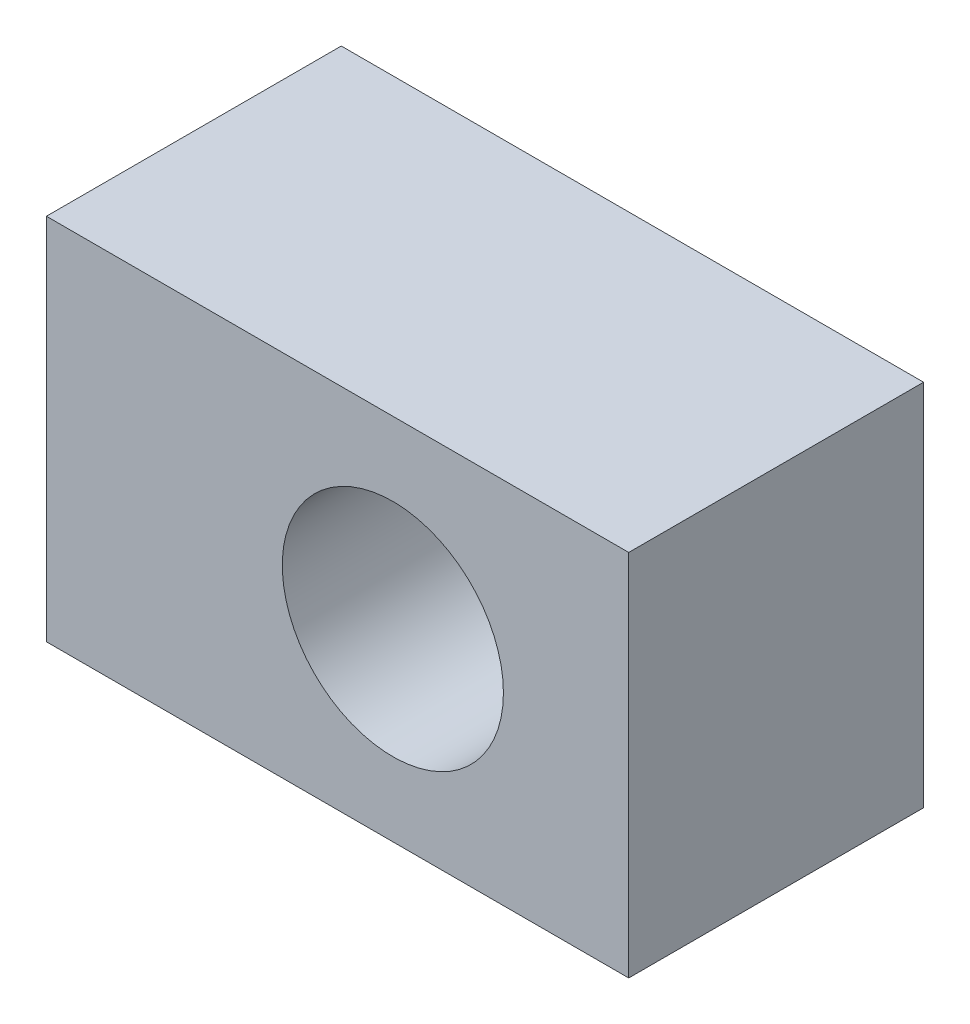
ISO-10303-21;
HEADER;
FILE_DESCRIPTION(('STEP AP214'),'2;1');
FILE_NAME('part.step','',(''),(''),'','','');
FILE_SCHEMA(('AUTOMOTIVE_DESIGN { 1 0 10303 214 1 1 1 1 }'));
ENDSEC;
DATA;
#1=APPLICATION_CONTEXT('core data for automotive mechanical design processes');
#2=APPLICATION_PROTOCOL_DEFINITION('international standard','automotive_design',2000,#1);
#3=PRODUCT_CONTEXT('',#1,'mechanical');
#4=PRODUCT('Part','Part','',(#3));
#5=PRODUCT_RELATED_PRODUCT_CATEGORY('part','',(#4));
#6=PRODUCT_DEFINITION_FORMATION('','',#4);
#7=PRODUCT_DEFINITION_CONTEXT('part definition',#1,'design');
#8=PRODUCT_DEFINITION('design','',#6,#7);
#9=PRODUCT_DEFINITION_SHAPE('','',#8);
#10=(LENGTH_UNIT() NAMED_UNIT(*) SI_UNIT(.MILLI.,.METRE.));
#11=(NAMED_UNIT(*) PLANE_ANGLE_UNIT() SI_UNIT($,.RADIAN.));
#12=(NAMED_UNIT(*) SI_UNIT($,.STERADIAN.) SOLID_ANGLE_UNIT());
#13=UNCERTAINTY_MEASURE_WITH_UNIT(LENGTH_MEASURE(1.E-05),#10,'distance_accuracy_value','');
#14=(GEOMETRIC_REPRESENTATION_CONTEXT(3) GLOBAL_UNCERTAINTY_ASSIGNED_CONTEXT((#13)) GLOBAL_UNIT_ASSIGNED_CONTEXT((#10,
#11,#12)) REPRESENTATION_CONTEXT('',''));
#15=CARTESIAN_POINT('',(0.,0.,0.));
#16=DIRECTION('',(0.,0.,1.));
#17=DIRECTION('',(1.,0.,0.));
#18=AXIS2_PLACEMENT_3D('',#15,#16,#17);
#19=CARTESIAN_POINT('',(0.,0.,40.));
#20=DIRECTION('',(0.,0.,-1.));
#21=DIRECTION('',(-1.,0.,0.));
#22=AXIS2_PLACEMENT_3D('',#19,#20,#21);
#23=PLANE('',#22);
#24=DIRECTION('',(0.,-1.,0.));
#25=VECTOR('',#24,1.);
#26=CARTESIAN_POINT('',(0.,0.,40.));
#27=LINE('',#26,#25);
#28=CARTESIAN_POINT('',(0.,50.,40.));
#29=VERTEX_POINT('',#28);
#30=CARTESIAN_POINT('',(0.,0.,40.));
#31=VERTEX_POINT('',#30);
#32=EDGE_CURVE('E87',#29,#31,#27,.T.);
#33=ORIENTED_EDGE('',*,*,#32,.T.);
#34=DIRECTION('',(1.,0.,0.));
#35=VECTOR('',#34,1.);
#36=CARTESIAN_POINT('',(0.,0.,40.));
#37=LINE('',#36,#35);
#38=CARTESIAN_POINT('',(79.,0.,40.));
#39=VERTEX_POINT('',#38);
#40=EDGE_CURVE('E82',#31,#39,#37,.T.);
#41=ORIENTED_EDGE('',*,*,#40,.T.);
#42=DIRECTION('',(0.,1.,0.));
#43=VECTOR('',#42,1.);
#44=CARTESIAN_POINT('',(79.,0.,40.));
#45=LINE('',#44,#43);
#46=CARTESIAN_POINT('',(79.,50.,40.));
#47=VERTEX_POINT('',#46);
#48=EDGE_CURVE('E85',#39,#47,#45,.T.);
#49=ORIENTED_EDGE('',*,*,#48,.T.);
#50=DIRECTION('',(-1.,0.,0.));
#51=VECTOR('',#50,1.);
#52=CARTESIAN_POINT('',(0.,50.,40.));
#53=LINE('',#52,#51);
#54=EDGE_CURVE('E52',#47,#29,#53,.T.);
#55=ORIENTED_EDGE('',*,*,#54,.T.);
#56=EDGE_LOOP('',(#33,#41,#49,#55));
#57=FACE_BOUND('',#56,.T.);
#58=CARTESIAN_POINT('',(47.,25.,40.));
#59=DIRECTION('',(0.,0.,1.));
#60=DIRECTION('',(1.,0.,0.));
#61=AXIS2_PLACEMENT_3D('',#58,#59,#60);
#62=CIRCLE('',#61,15.);
#63=CARTESIAN_POINT('',(62.,25.,40.));
#64=VERTEX_POINT('',#63);
#65=EDGE_CURVE('E102',#64,#64,#62,.T.);
#66=ORIENTED_EDGE('',*,*,#65,.F.);
#67=EDGE_LOOP('',(#66));
#68=FACE_BOUND('',#67,.T.);
#69=ADVANCED_FACE('F35',(#57,#68),#23,.F.);
#70=CARTESIAN_POINT('',(0.,0.,0.));
#71=DIRECTION('',(0.,0.,-1.));
#72=DIRECTION('',(-1.,0.,0.));
#73=AXIS2_PLACEMENT_3D('',#70,#71,#72);
#74=PLANE('',#73);
#75=DIRECTION('',(0.,-1.,0.));
#76=VECTOR('',#75,1.);
#77=CARTESIAN_POINT('',(0.,0.,0.));
#78=LINE('',#77,#76);
#79=CARTESIAN_POINT('',(0.,50.,0.));
#80=VERTEX_POINT('',#79);
#81=CARTESIAN_POINT('',(0.,0.,0.));
#82=VERTEX_POINT('',#81);
#83=EDGE_CURVE('E99',#80,#82,#78,.T.);
#84=ORIENTED_EDGE('',*,*,#83,.F.);
#85=DIRECTION('',(-1.,0.,0.));
#86=VECTOR('',#85,1.);
#87=CARTESIAN_POINT('',(0.,50.,0.));
#88=LINE('',#87,#86);
#89=CARTESIAN_POINT('',(79.,50.,0.));
#90=VERTEX_POINT('',#89);
#91=EDGE_CURVE('E75',#90,#80,#88,.T.);
#92=ORIENTED_EDGE('',*,*,#91,.F.);
#93=DIRECTION('',(0.,1.,0.));
#94=VECTOR('',#93,1.);
#95=CARTESIAN_POINT('',(79.,0.,0.));
#96=LINE('',#95,#94);
#97=CARTESIAN_POINT('',(79.,0.,0.));
#98=VERTEX_POINT('',#97);
#99=EDGE_CURVE('E69',#98,#90,#96,.T.);
#100=ORIENTED_EDGE('',*,*,#99,.F.);
#101=DIRECTION('',(1.,0.,0.));
#102=VECTOR('',#101,1.);
#103=CARTESIAN_POINT('',(0.,0.,0.));
#104=LINE('',#103,#102);
#105=EDGE_CURVE('E91',#82,#98,#104,.T.);
#106=ORIENTED_EDGE('',*,*,#105,.F.);
#107=EDGE_LOOP('',(#84,#92,#100,#106));
#108=FACE_BOUND('',#107,.T.);
#109=CARTESIAN_POINT('',(47.,25.,0.));
#110=DIRECTION('',(0.,0.,1.));
#111=DIRECTION('',(1.,0.,0.));
#112=AXIS2_PLACEMENT_3D('',#109,#110,#111);
#113=CIRCLE('',#112,15.);
#114=CARTESIAN_POINT('',(62.,25.,0.));
#115=VERTEX_POINT('',#114);
#116=EDGE_CURVE('E114',#115,#115,#113,.T.);
#117=ORIENTED_EDGE('',*,*,#116,.T.);
#118=EDGE_LOOP('',(#117));
#119=FACE_BOUND('',#118,.T.);
#120=ADVANCED_FACE('F110',(#108,#119),#74,.T.);
#121=CARTESIAN_POINT('',(0.,0.,40.));
#122=DIRECTION('',(1.,0.,0.));
#123=DIRECTION('',(0.,1.,0.));
#124=AXIS2_PLACEMENT_3D('',#121,#122,#123);
#125=PLANE('',#124);
#126=ORIENTED_EDGE('',*,*,#83,.T.);
#127=DIRECTION('',(0.,0.,-1.));
#128=VECTOR('',#127,1.);
#129=CARTESIAN_POINT('',(0.,0.,40.));
#130=LINE('',#129,#128);
#131=EDGE_CURVE('E11',#31,#82,#130,.T.);
#132=ORIENTED_EDGE('',*,*,#131,.F.);
#133=ORIENTED_EDGE('',*,*,#32,.F.);
#134=DIRECTION('',(0.,0.,-1.));
#135=VECTOR('',#134,1.);
#136=CARTESIAN_POINT('',(0.,50.,40.));
#137=LINE('',#136,#135);
#138=EDGE_CURVE('E95',#29,#80,#137,.T.);
#139=ORIENTED_EDGE('',*,*,#138,.T.);
#140=EDGE_LOOP('',(#126,#132,#133,#139));
#141=FACE_BOUND('',#140,.T.);
#142=ADVANCED_FACE('F37',(#141),#125,.F.);
#143=CARTESIAN_POINT('',(0.,0.,40.));
#144=DIRECTION('',(0.,1.,0.));
#145=DIRECTION('',(0.,0.,1.));
#146=AXIS2_PLACEMENT_3D('',#143,#144,#145);
#147=PLANE('',#146);
#148=ORIENTED_EDGE('',*,*,#105,.T.);
#149=DIRECTION('',(0.,0.,-1.));
#150=VECTOR('',#149,1.);
#151=CARTESIAN_POINT('',(79.,0.,40.));
#152=LINE('',#151,#150);
#153=EDGE_CURVE('E44',#39,#98,#152,.T.);
#154=ORIENTED_EDGE('',*,*,#153,.F.);
#155=ORIENTED_EDGE('',*,*,#40,.F.);
#156=ORIENTED_EDGE('',*,*,#131,.T.);
#157=EDGE_LOOP('',(#148,#154,#155,#156));
#158=FACE_BOUND('',#157,.T.);
#159=ADVANCED_FACE('F90',(#158),#147,.F.);
#160=CARTESIAN_POINT('',(79.,0.,40.));
#161=DIRECTION('',(-1.,0.,0.));
#162=DIRECTION('',(0.,-1.,0.));
#163=AXIS2_PLACEMENT_3D('',#160,#161,#162);
#164=PLANE('',#163);
#165=ORIENTED_EDGE('',*,*,#99,.T.);
#166=DIRECTION('',(0.,0.,-1.));
#167=VECTOR('',#166,1.);
#168=CARTESIAN_POINT('',(79.,50.,40.));
#169=LINE('',#168,#167);
#170=EDGE_CURVE('E92',#47,#90,#169,.T.);
#171=ORIENTED_EDGE('',*,*,#170,.F.);
#172=ORIENTED_EDGE('',*,*,#48,.F.);
#173=ORIENTED_EDGE('',*,*,#153,.T.);
#174=EDGE_LOOP('',(#165,#171,#172,#173));
#175=FACE_BOUND('',#174,.T.);
#176=ADVANCED_FACE('F93',(#175),#164,.F.);
#177=CARTESIAN_POINT('',(0.,50.,40.));
#178=DIRECTION('',(0.,-1.,0.));
#179=DIRECTION('',(0.,0.,-1.));
#180=AXIS2_PLACEMENT_3D('',#177,#178,#179);
#181=PLANE('',#180);
#182=ORIENTED_EDGE('',*,*,#91,.T.);
#183=ORIENTED_EDGE('',*,*,#138,.F.);
#184=ORIENTED_EDGE('',*,*,#54,.F.);
#185=ORIENTED_EDGE('',*,*,#170,.T.);
#186=EDGE_LOOP('',(#182,#183,#184,#185));
#187=FACE_BOUND('',#186,.T.);
#188=ADVANCED_FACE('F107',(#187),#181,.F.);
#189=CARTESIAN_POINT('',(47.,25.,40.));
#190=DIRECTION('',(0.,0.,-1.));
#191=DIRECTION('',(-1.,0.,0.));
#192=AXIS2_PLACEMENT_3D('',#189,#190,#191);
#193=CYLINDRICAL_SURFACE('',#192,15.);
#194=ORIENTED_EDGE('',*,*,#65,.T.);
#195=EDGE_LOOP('',(#194));
#196=FACE_BOUND('',#195,.T.);
#197=ORIENTED_EDGE('',*,*,#116,.F.);
#198=EDGE_LOOP('',(#197));
#199=FACE_BOUND('',#198,.T.);
#200=ADVANCED_FACE('F120',(#196,#199),#193,.F.);
#201=CLOSED_SHELL('',(#69,#120,#142,#159,#176,#188,#200));
#202=MANIFOLD_SOLID_BREP('B2',#201);
#203=ADVANCED_BREP_SHAPE_REPRESENTATION('',(#18,#202),#14);
#204=SHAPE_DEFINITION_REPRESENTATION(#9,#203);
ENDSEC;
END-ISO-10303-21;
